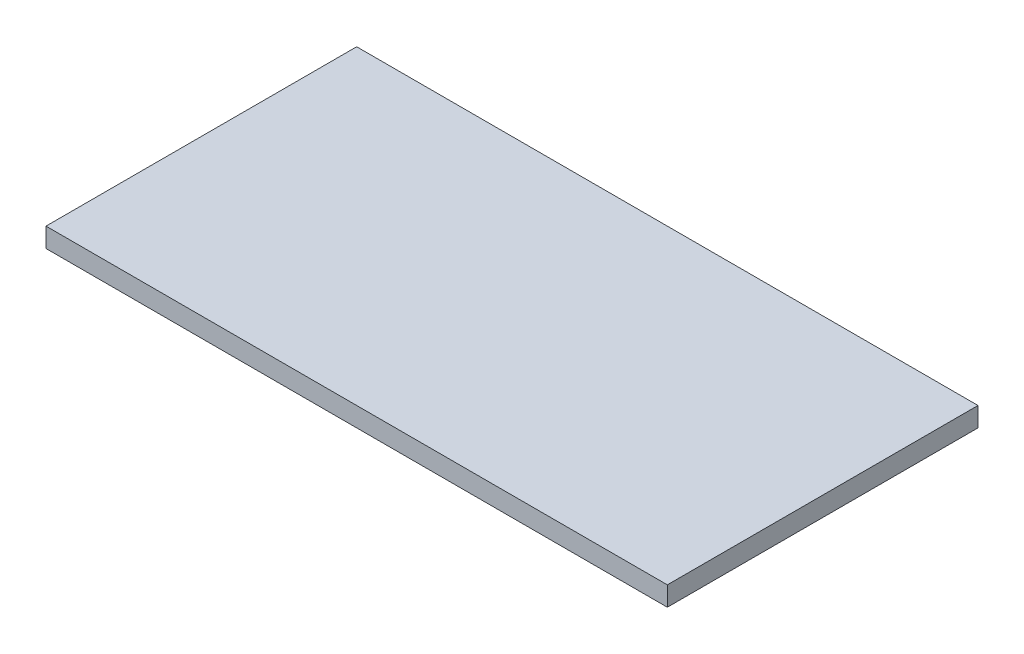
ISO-10303-21;
HEADER;
FILE_DESCRIPTION(('STEP AP214'),'2;1');
FILE_NAME('part.step','',(''),(''),'','','');
FILE_SCHEMA(('AUTOMOTIVE_DESIGN { 1 0 10303 214 1 1 1 1 }'));
ENDSEC;
DATA;
#1=APPLICATION_CONTEXT('core data for automotive mechanical design processes');
#2=APPLICATION_PROTOCOL_DEFINITION('international standard','automotive_design',2000,#1);
#3=PRODUCT_CONTEXT('',#1,'mechanical');
#4=PRODUCT('Part','Part','',(#3));
#5=PRODUCT_RELATED_PRODUCT_CATEGORY('part','',(#4));
#6=PRODUCT_DEFINITION_FORMATION('','',#4);
#7=PRODUCT_DEFINITION_CONTEXT('part definition',#1,'design');
#8=PRODUCT_DEFINITION('design','',#6,#7);
#9=PRODUCT_DEFINITION_SHAPE('','',#8);
#10=(LENGTH_UNIT() NAMED_UNIT(*) SI_UNIT(.MILLI.,.METRE.));
#11=(NAMED_UNIT(*) PLANE_ANGLE_UNIT() SI_UNIT($,.RADIAN.));
#12=(NAMED_UNIT(*) SI_UNIT($,.STERADIAN.) SOLID_ANGLE_UNIT());
#13=UNCERTAINTY_MEASURE_WITH_UNIT(LENGTH_MEASURE(1.E-05),#10,'distance_accuracy_value','');
#14=(GEOMETRIC_REPRESENTATION_CONTEXT(3) GLOBAL_UNCERTAINTY_ASSIGNED_CONTEXT((#13)) GLOBAL_UNIT_ASSIGNED_CONTEXT((#10,
#11,#12)) REPRESENTATION_CONTEXT('',''));
#15=CARTESIAN_POINT('',(0.,0.,0.));
#16=DIRECTION('',(0.,0.,1.));
#17=DIRECTION('',(1.,0.,0.));
#18=AXIS2_PLACEMENT_3D('',#15,#16,#17);
#19=CARTESIAN_POINT('',(80.,5.,-40.));
#20=DIRECTION('',(-1.,0.,0.));
#21=DIRECTION('',(0.,0.,1.));
#22=AXIS2_PLACEMENT_3D('',#19,#20,#21);
#23=PLANE('',#22);
#24=DIRECTION('',(0.,0.,-1.));
#25=VECTOR('',#24,1.);
#26=CARTESIAN_POINT('',(80.,0.,-40.));
#27=LINE('',#26,#25);
#28=CARTESIAN_POINT('',(80.,0.,40.));
#29=VERTEX_POINT('',#28);
#30=CARTESIAN_POINT('',(80.,0.,-40.));
#31=VERTEX_POINT('',#30);
#32=EDGE_CURVE('E111',#29,#31,#27,.T.);
#33=ORIENTED_EDGE('',*,*,#32,.T.);
#34=DIRECTION('',(0.,-1.,0.));
#35=VECTOR('',#34,1.);
#36=CARTESIAN_POINT('',(80.,5.,-40.));
#37=LINE('',#36,#35);
#38=CARTESIAN_POINT('',(80.,5.,-40.));
#39=VERTEX_POINT('',#38);
#40=EDGE_CURVE('E11',#39,#31,#37,.T.);
#41=ORIENTED_EDGE('',*,*,#40,.F.);
#42=DIRECTION('',(0.,0.,-1.));
#43=VECTOR('',#42,1.);
#44=CARTESIAN_POINT('',(80.,5.,-40.));
#45=LINE('',#44,#43);
#46=CARTESIAN_POINT('',(80.,5.,40.));
#47=VERTEX_POINT('',#46);
#48=EDGE_CURVE('E95',#47,#39,#45,.T.);
#49=ORIENTED_EDGE('',*,*,#48,.F.);
#50=DIRECTION('',(0.,-1.,0.));
#51=VECTOR('',#50,1.);
#52=CARTESIAN_POINT('',(80.,5.,40.));
#53=LINE('',#52,#51);
#54=EDGE_CURVE('E107',#47,#29,#53,.T.);
#55=ORIENTED_EDGE('',*,*,#54,.T.);
#56=EDGE_LOOP('',(#33,#41,#49,#55));
#57=FACE_BOUND('',#56,.T.);
#58=ADVANCED_FACE('F43',(#57),#23,.F.);
#59=CARTESIAN_POINT('',(-80.,5.,-40.));
#60=DIRECTION('',(0.,0.,1.));
#61=DIRECTION('',(1.,0.,0.));
#62=AXIS2_PLACEMENT_3D('',#59,#60,#61);
#63=PLANE('',#62);
#64=DIRECTION('',(-1.,0.,0.));
#65=VECTOR('',#64,1.);
#66=CARTESIAN_POINT('',(-80.,0.,-40.));
#67=LINE('',#66,#65);
#68=CARTESIAN_POINT('',(-80.,0.,-40.));
#69=VERTEX_POINT('',#68);
#70=EDGE_CURVE('E100',#31,#69,#67,.T.);
#71=ORIENTED_EDGE('',*,*,#70,.T.);
#72=DIRECTION('',(0.,-1.,0.));
#73=VECTOR('',#72,1.);
#74=CARTESIAN_POINT('',(-80.,5.,-40.));
#75=LINE('',#74,#73);
#76=CARTESIAN_POINT('',(-80.,5.,-40.));
#77=VERTEX_POINT('',#76);
#78=EDGE_CURVE('E52',#77,#69,#75,.T.);
#79=ORIENTED_EDGE('',*,*,#78,.F.);
#80=DIRECTION('',(-1.,0.,0.));
#81=VECTOR('',#80,1.);
#82=CARTESIAN_POINT('',(-80.,5.,-40.));
#83=LINE('',#82,#81);
#84=EDGE_CURVE('E90',#39,#77,#83,.T.);
#85=ORIENTED_EDGE('',*,*,#84,.F.);
#86=ORIENTED_EDGE('',*,*,#40,.T.);
#87=EDGE_LOOP('',(#71,#79,#85,#86));
#88=FACE_BOUND('',#87,.T.);
#89=ADVANCED_FACE('F99',(#88),#63,.F.);
#90=CARTESIAN_POINT('',(-80.,5.,-40.));
#91=DIRECTION('',(1.,0.,0.));
#92=DIRECTION('',(0.,0.,-1.));
#93=AXIS2_PLACEMENT_3D('',#90,#91,#92);
#94=PLANE('',#93);
#95=DIRECTION('',(0.,0.,1.));
#96=VECTOR('',#95,1.);
#97=CARTESIAN_POINT('',(-80.,0.,-40.));
#98=LINE('',#97,#96);
#99=CARTESIAN_POINT('',(-80.,0.,40.));
#100=VERTEX_POINT('',#99);
#101=EDGE_CURVE('E77',#69,#100,#98,.T.);
#102=ORIENTED_EDGE('',*,*,#101,.T.);
#103=DIRECTION('',(0.,-1.,0.));
#104=VECTOR('',#103,1.);
#105=CARTESIAN_POINT('',(-80.,5.,40.));
#106=LINE('',#105,#104);
#107=CARTESIAN_POINT('',(-80.,5.,40.));
#108=VERTEX_POINT('',#107);
#109=EDGE_CURVE('E102',#108,#100,#106,.T.);
#110=ORIENTED_EDGE('',*,*,#109,.F.);
#111=DIRECTION('',(0.,0.,1.));
#112=VECTOR('',#111,1.);
#113=CARTESIAN_POINT('',(-80.,5.,-40.));
#114=LINE('',#113,#112);
#115=EDGE_CURVE('E93',#77,#108,#114,.T.);
#116=ORIENTED_EDGE('',*,*,#115,.F.);
#117=ORIENTED_EDGE('',*,*,#78,.T.);
#118=EDGE_LOOP('',(#102,#110,#116,#117));
#119=FACE_BOUND('',#118,.T.);
#120=ADVANCED_FACE('F103',(#119),#94,.F.);
#121=CARTESIAN_POINT('',(-80.,5.,40.));
#122=DIRECTION('',(0.,0.,-1.));
#123=DIRECTION('',(-1.,0.,0.));
#124=AXIS2_PLACEMENT_3D('',#121,#122,#123);
#125=PLANE('',#124);
#126=DIRECTION('',(1.,0.,0.));
#127=VECTOR('',#126,1.);
#128=CARTESIAN_POINT('',(-80.,0.,40.));
#129=LINE('',#128,#127);
#130=EDGE_CURVE('E83',#100,#29,#129,.T.);
#131=ORIENTED_EDGE('',*,*,#130,.T.);
#132=ORIENTED_EDGE('',*,*,#54,.F.);
#133=DIRECTION('',(1.,0.,0.));
#134=VECTOR('',#133,1.);
#135=CARTESIAN_POINT('',(-80.,5.,40.));
#136=LINE('',#135,#134);
#137=EDGE_CURVE('E60',#108,#47,#136,.T.);
#138=ORIENTED_EDGE('',*,*,#137,.F.);
#139=ORIENTED_EDGE('',*,*,#109,.T.);
#140=EDGE_LOOP('',(#131,#132,#138,#139));
#141=FACE_BOUND('',#140,.T.);
#142=ADVANCED_FACE('F124',(#141),#125,.F.);
#143=CARTESIAN_POINT('',(0.,5.,0.));
#144=DIRECTION('',(0.,1.,0.));
#145=DIRECTION('',(0.,0.,1.));
#146=AXIS2_PLACEMENT_3D('',#143,#144,#145);
#147=PLANE('',#146);
#148=ORIENTED_EDGE('',*,*,#48,.T.);
#149=ORIENTED_EDGE('',*,*,#84,.T.);
#150=ORIENTED_EDGE('',*,*,#115,.T.);
#151=ORIENTED_EDGE('',*,*,#137,.T.);
#152=EDGE_LOOP('',(#148,#149,#150,#151));
#153=FACE_BOUND('',#152,.T.);
#154=ADVANCED_FACE('F91',(#153),#147,.T.);
#155=CARTESIAN_POINT('',(0.,0.,0.));
#156=DIRECTION('',(0.,1.,0.));
#157=DIRECTION('',(0.,0.,1.));
#158=AXIS2_PLACEMENT_3D('',#155,#156,#157);
#159=PLANE('',#158);
#160=ORIENTED_EDGE('',*,*,#32,.F.);
#161=ORIENTED_EDGE('',*,*,#130,.F.);
#162=ORIENTED_EDGE('',*,*,#101,.F.);
#163=ORIENTED_EDGE('',*,*,#70,.F.);
#164=EDGE_LOOP('',(#160,#161,#162,#163));
#165=FACE_BOUND('',#164,.T.);
#166=ADVANCED_FACE('F127',(#165),#159,.F.);
#167=CLOSED_SHELL('',(#58,#89,#120,#142,#154,#166));
#168=MANIFOLD_SOLID_BREP('B2',#167);
#169=ADVANCED_BREP_SHAPE_REPRESENTATION('',(#18,#168),#14);
#170=SHAPE_DEFINITION_REPRESENTATION(#9,#169);
ENDSEC;
END-ISO-10303-21;
